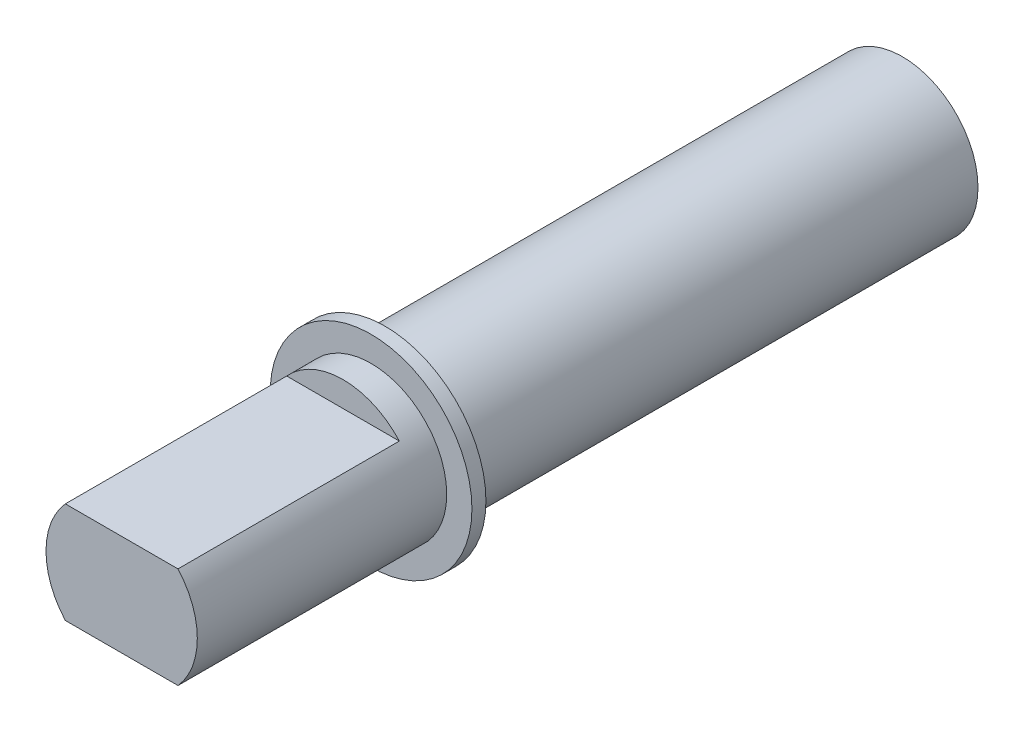
ISO-10303-21;
HEADER;
FILE_DESCRIPTION(('STEP AP214'),'2;1');
FILE_NAME('part.step','',(''),(''),'','','');
FILE_SCHEMA(('AUTOMOTIVE_DESIGN { 1 0 10303 214 1 1 1 1 }'));
ENDSEC;
DATA;
#1=APPLICATION_CONTEXT('core data for automotive mechanical design processes');
#2=APPLICATION_PROTOCOL_DEFINITION('international standard','automotive_design',2000,#1);
#3=PRODUCT_CONTEXT('',#1,'mechanical');
#4=PRODUCT('Part','Part','',(#3));
#5=PRODUCT_RELATED_PRODUCT_CATEGORY('part','',(#4));
#6=PRODUCT_DEFINITION_FORMATION('','',#4);
#7=PRODUCT_DEFINITION_CONTEXT('part definition',#1,'design');
#8=PRODUCT_DEFINITION('design','',#6,#7);
#9=PRODUCT_DEFINITION_SHAPE('','',#8);
#10=(LENGTH_UNIT() NAMED_UNIT(*) SI_UNIT(.MILLI.,.METRE.));
#11=(NAMED_UNIT(*) PLANE_ANGLE_UNIT() SI_UNIT($,.RADIAN.));
#12=(NAMED_UNIT(*) SI_UNIT($,.STERADIAN.) SOLID_ANGLE_UNIT());
#13=UNCERTAINTY_MEASURE_WITH_UNIT(LENGTH_MEASURE(1.E-05),#10,'distance_accuracy_value','');
#14=(GEOMETRIC_REPRESENTATION_CONTEXT(3) GLOBAL_UNCERTAINTY_ASSIGNED_CONTEXT((#13)) GLOBAL_UNIT_ASSIGNED_CONTEXT((#10,
#11,#12)) REPRESENTATION_CONTEXT('',''));
#15=CARTESIAN_POINT('',(0.,0.,0.));
#16=DIRECTION('',(0.,0.,1.));
#17=DIRECTION('',(1.,0.,0.));
#18=AXIS2_PLACEMENT_3D('',#15,#16,#17);
#19=CARTESIAN_POINT('',(0.,0.,10.73));
#20=DIRECTION('',(0.,0.,1.));
#21=DIRECTION('',(1.,0.,0.));
#22=AXIS2_PLACEMENT_3D('',#19,#20,#21);
#23=PLANE('',#22);
#24=CARTESIAN_POINT('',(0.,0.,10.73));
#25=DIRECTION('',(0.,0.,1.));
#26=DIRECTION('',(1.,0.,0.));
#27=AXIS2_PLACEMENT_3D('',#24,#25,#26);
#28=CIRCLE('',#27,2.7);
#29=CARTESIAN_POINT('',(-2.01,-1.80274790250884,10.73));
#30=VERTEX_POINT('',#29);
#31=CARTESIAN_POINT('',(2.01,-1.80274790250884,10.73));
#32=VERTEX_POINT('',#31);
#33=EDGE_CURVE('E50',#30,#32,#28,.T.);
#34=ORIENTED_EDGE('',*,*,#33,.T.);
#35=DIRECTION('',(-1.,0.,0.));
#36=VECTOR('',#35,1.);
#37=CARTESIAN_POINT('',(0.,-1.80274790250884,10.73));
#38=LINE('',#37,#36);
#39=EDGE_CURVE('E11',#32,#30,#38,.T.);
#40=ORIENTED_EDGE('',*,*,#39,.T.);
#41=EDGE_LOOP('',(#34,#40));
#42=FACE_BOUND('',#41,.T.);
#43=ADVANCED_FACE('F37',(#42),#23,.T.);
#44=CARTESIAN_POINT('',(0.,0.,9.23));
#45=DIRECTION('',(0.,0.,-1.));
#46=DIRECTION('',(-1.,0.,0.));
#47=AXIS2_PLACEMENT_3D('',#44,#45,#46);
#48=CYLINDRICAL_SURFACE('',#47,2.7);
#49=CARTESIAN_POINT('',(0.,0.,9.23));
#50=DIRECTION('',(0.,0.,1.));
#51=DIRECTION('',(1.,0.,0.));
#52=AXIS2_PLACEMENT_3D('',#49,#50,#51);
#53=CIRCLE('',#52,2.7);
#54=CARTESIAN_POINT('',(2.7,0.,9.23));
#55=VERTEX_POINT('',#54);
#56=EDGE_CURVE('E106',#55,#55,#53,.T.);
#57=ORIENTED_EDGE('',*,*,#56,.F.);
#58=EDGE_LOOP('',(#57));
#59=FACE_BOUND('',#58,.T.);
#60=CARTESIAN_POINT('',(0.,0.,-9.23));
#61=DIRECTION('',(0.,0.,1.));
#62=DIRECTION('',(1.,0.,0.));
#63=AXIS2_PLACEMENT_3D('',#60,#61,#62);
#64=CIRCLE('',#63,2.7);
#65=CARTESIAN_POINT('',(2.7,0.,-9.23));
#66=VERTEX_POINT('',#65);
#67=EDGE_CURVE('E110',#66,#66,#64,.T.);
#68=ORIENTED_EDGE('',*,*,#67,.T.);
#69=EDGE_LOOP('',(#68));
#70=FACE_BOUND('',#69,.T.);
#71=ADVANCED_FACE('F39',(#59,#70),#48,.T.);
#72=CARTESIAN_POINT('',(0.,0.,-9.23));
#73=DIRECTION('',(0.,0.,1.));
#74=DIRECTION('',(1.,0.,0.));
#75=AXIS2_PLACEMENT_3D('',#72,#73,#74);
#76=PLANE('',#75);
#77=ORIENTED_EDGE('',*,*,#67,.F.);
#78=EDGE_LOOP('',(#77));
#79=FACE_BOUND('',#78,.T.);
#80=ADVANCED_FACE('F140',(#79),#76,.F.);
#81=CARTESIAN_POINT('',(0.,0.,9.73));
#82=DIRECTION('',(0.,0.,-1.));
#83=DIRECTION('',(-1.,0.,0.));
#84=AXIS2_PLACEMENT_3D('',#81,#82,#83);
#85=CYLINDRICAL_SURFACE('',#84,3.6);
#86=CARTESIAN_POINT('',(0.,0.,9.73));
#87=DIRECTION('',(0.,0.,1.));
#88=DIRECTION('',(1.,0.,0.));
#89=AXIS2_PLACEMENT_3D('',#86,#87,#88);
#90=CIRCLE('',#89,3.6);
#91=CARTESIAN_POINT('',(3.6,0.,9.73));
#92=VERTEX_POINT('',#91);
#93=EDGE_CURVE('E107',#92,#92,#90,.T.);
#94=ORIENTED_EDGE('',*,*,#93,.F.);
#95=EDGE_LOOP('',(#94));
#96=FACE_BOUND('',#95,.T.);
#97=CARTESIAN_POINT('',(0.,0.,9.23));
#98=DIRECTION('',(0.,0.,1.));
#99=DIRECTION('',(1.,0.,0.));
#100=AXIS2_PLACEMENT_3D('',#97,#98,#99);
#101=CIRCLE('',#100,3.6);
#102=CARTESIAN_POINT('',(3.6,0.,9.23));
#103=VERTEX_POINT('',#102);
#104=EDGE_CURVE('E102',#103,#103,#101,.T.);
#105=ORIENTED_EDGE('',*,*,#104,.T.);
#106=EDGE_LOOP('',(#105));
#107=FACE_BOUND('',#106,.T.);
#108=ADVANCED_FACE('F145',(#96,#107),#85,.T.);
#109=CARTESIAN_POINT('',(0.,0.,9.73));
#110=DIRECTION('',(0.,0.,1.));
#111=DIRECTION('',(1.,0.,0.));
#112=AXIS2_PLACEMENT_3D('',#109,#110,#111);
#113=PLANE('',#112);
#114=CARTESIAN_POINT('',(0.,0.,9.73));
#115=DIRECTION('',(0.,0.,1.));
#116=DIRECTION('',(1.,0.,0.));
#117=AXIS2_PLACEMENT_3D('',#114,#115,#116);
#118=CIRCLE('',#117,2.7);
#119=CARTESIAN_POINT('',(2.7,0.,9.73));
#120=VERTEX_POINT('',#119);
#121=EDGE_CURVE('E103',#120,#120,#118,.T.);
#122=ORIENTED_EDGE('',*,*,#121,.F.);
#123=EDGE_LOOP('',(#122));
#124=FACE_BOUND('',#123,.T.);
#125=ORIENTED_EDGE('',*,*,#93,.T.);
#126=EDGE_LOOP('',(#125));
#127=FACE_BOUND('',#126,.T.);
#128=ADVANCED_FACE('F153',(#124,#127),#113,.T.);
#129=CARTESIAN_POINT('',(0.,0.,9.23));
#130=DIRECTION('',(0.,0.,1.));
#131=DIRECTION('',(1.,0.,0.));
#132=AXIS2_PLACEMENT_3D('',#129,#130,#131);
#133=PLANE('',#132);
#134=ORIENTED_EDGE('',*,*,#56,.T.);
#135=EDGE_LOOP('',(#134));
#136=FACE_BOUND('',#135,.T.);
#137=ORIENTED_EDGE('',*,*,#104,.F.);
#138=EDGE_LOOP('',(#137));
#139=FACE_BOUND('',#138,.T.);
#140=ADVANCED_FACE('F133',(#136,#139),#133,.F.);
#141=CARTESIAN_POINT('',(0.,0.,10.73));
#142=DIRECTION('',(0.,0.,-1.));
#143=DIRECTION('',(-1.,0.,0.));
#144=AXIS2_PLACEMENT_3D('',#141,#142,#143);
#145=CYLINDRICAL_SURFACE('',#144,2.7);
#146=ORIENTED_EDGE('',*,*,#121,.T.);
#147=EDGE_LOOP('',(#146));
#148=FACE_BOUND('',#147,.T.);
#149=CARTESIAN_POINT('',(2.01,1.80274790250884,10.73));
#150=VERTEX_POINT('',#149);
#151=CARTESIAN_POINT('',(-2.01,1.80274790250884,10.73));
#152=VERTEX_POINT('',#151);
#153=EDGE_CURVE('E96',#150,#152,#28,.T.);
#154=ORIENTED_EDGE('',*,*,#153,.F.);
#155=DIRECTION('',(0.,0.,-1.));
#156=VECTOR('',#155,1.);
#157=CARTESIAN_POINT('',(2.01,1.80274790250884,18.63));
#158=LINE('',#157,#156);
#159=CARTESIAN_POINT('',(2.01,1.80274790250884,18.63));
#160=VERTEX_POINT('',#159);
#161=EDGE_CURVE('E98',#160,#150,#158,.T.);
#162=ORIENTED_EDGE('',*,*,#161,.F.);
#163=CARTESIAN_POINT('',(0.,0.,18.63));
#164=DIRECTION('',(0.,0.,1.));
#165=DIRECTION('',(1.,0.,0.));
#166=AXIS2_PLACEMENT_3D('',#163,#164,#165);
#167=CIRCLE('',#166,2.7);
#168=CARTESIAN_POINT('',(2.01,-1.80274790250884,18.63));
#169=VERTEX_POINT('',#168);
#170=EDGE_CURVE('E82',#169,#160,#167,.T.);
#171=ORIENTED_EDGE('',*,*,#170,.F.);
#172=DIRECTION('',(0.,0.,-1.));
#173=VECTOR('',#172,1.);
#174=CARTESIAN_POINT('',(2.01,-1.80274790250884,18.63));
#175=LINE('',#174,#173);
#176=EDGE_CURVE('E79',#169,#32,#175,.T.);
#177=ORIENTED_EDGE('',*,*,#176,.T.);
#178=ORIENTED_EDGE('',*,*,#33,.F.);
#179=DIRECTION('',(0.,0.,-1.));
#180=VECTOR('',#179,1.);
#181=CARTESIAN_POINT('',(-2.01,-1.80274790250884,18.63));
#182=LINE('',#181,#180);
#183=CARTESIAN_POINT('',(-2.01,-1.80274790250884,18.63));
#184=VERTEX_POINT('',#183);
#185=EDGE_CURVE('E77',#184,#30,#182,.T.);
#186=ORIENTED_EDGE('',*,*,#185,.F.);
#187=CARTESIAN_POINT('',(-2.01,1.80274790250884,18.63));
#188=VERTEX_POINT('',#187);
#189=EDGE_CURVE('E83',#188,#184,#167,.T.);
#190=ORIENTED_EDGE('',*,*,#189,.F.);
#191=DIRECTION('',(0.,0.,-1.));
#192=VECTOR('',#191,1.);
#193=CARTESIAN_POINT('',(-2.01,1.80274790250884,18.63));
#194=LINE('',#193,#192);
#195=EDGE_CURVE('E120',#188,#152,#194,.T.);
#196=ORIENTED_EDGE('',*,*,#195,.T.);
#197=EDGE_LOOP('',(#154,#162,#171,#177,#178,#186,#190,#196));
#198=FACE_BOUND('',#197,.T.);
#199=ADVANCED_FACE('F94',(#148,#198),#145,.T.);
#200=DIRECTION('',(-1.,0.,0.));
#201=VECTOR('',#200,1.);
#202=CARTESIAN_POINT('',(0.,1.80274790250884,10.73));
#203=LINE('',#202,#201);
#204=EDGE_CURVE('E45',#150,#152,#203,.T.);
#205=ORIENTED_EDGE('',*,*,#204,.F.);
#206=ORIENTED_EDGE('',*,*,#153,.T.);
#207=EDGE_LOOP('',(#205,#206));
#208=FACE_BOUND('',#207,.T.);
#209=ADVANCED_FACE('F125',(#208),#23,.T.);
#210=CARTESIAN_POINT('',(0.,-1.80274790250884,18.63));
#211=DIRECTION('',(0.,1.,0.));
#212=DIRECTION('',(0.,0.,1.));
#213=AXIS2_PLACEMENT_3D('',#210,#211,#212);
#214=PLANE('',#213);
#215=ORIENTED_EDGE('',*,*,#39,.F.);
#216=ORIENTED_EDGE('',*,*,#176,.F.);
#217=DIRECTION('',(1.,0.,0.));
#218=VECTOR('',#217,1.);
#219=CARTESIAN_POINT('',(0.,-1.80274790250884,18.63));
#220=LINE('',#219,#218);
#221=EDGE_CURVE('E73',#184,#169,#220,.T.);
#222=ORIENTED_EDGE('',*,*,#221,.F.);
#223=ORIENTED_EDGE('',*,*,#185,.T.);
#224=EDGE_LOOP('',(#215,#216,#222,#223));
#225=FACE_BOUND('',#224,.T.);
#226=ADVANCED_FACE('F75',(#225),#214,.F.);
#227=CARTESIAN_POINT('',(0.,1.80274790250884,18.63));
#228=DIRECTION('',(0.,1.,0.));
#229=DIRECTION('',(0.,0.,1.));
#230=AXIS2_PLACEMENT_3D('',#227,#228,#229);
#231=PLANE('',#230);
#232=ORIENTED_EDGE('',*,*,#161,.T.);
#233=ORIENTED_EDGE('',*,*,#204,.T.);
#234=ORIENTED_EDGE('',*,*,#195,.F.);
#235=DIRECTION('',(1.,0.,0.));
#236=VECTOR('',#235,1.);
#237=CARTESIAN_POINT('',(0.,1.80274790250884,18.63));
#238=LINE('',#237,#236);
#239=EDGE_CURVE('E89',#188,#160,#238,.T.);
#240=ORIENTED_EDGE('',*,*,#239,.T.);
#241=EDGE_LOOP('',(#232,#233,#234,#240));
#242=FACE_BOUND('',#241,.T.);
#243=ADVANCED_FACE('F119',(#242),#231,.T.);
#244=CARTESIAN_POINT('',(0.,0.,18.63));
#245=DIRECTION('',(0.,0.,1.));
#246=DIRECTION('',(1.,0.,0.));
#247=AXIS2_PLACEMENT_3D('',#244,#245,#246);
#248=PLANE('',#247);
#249=ORIENTED_EDGE('',*,*,#189,.T.);
#250=ORIENTED_EDGE('',*,*,#221,.T.);
#251=ORIENTED_EDGE('',*,*,#170,.T.);
#252=ORIENTED_EDGE('',*,*,#239,.F.);
#253=EDGE_LOOP('',(#249,#250,#251,#252));
#254=FACE_BOUND('',#253,.T.);
#255=ADVANCED_FACE('F87',(#254),#248,.T.);
#256=CLOSED_SHELL('',(#43,#71,#80,#108,#128,#140,#199,#209,#226,#243,#255));
#257=MANIFOLD_SOLID_BREP('B2',#256);
#258=ADVANCED_BREP_SHAPE_REPRESENTATION('',(#18,#257),#14);
#259=SHAPE_DEFINITION_REPRESENTATION(#9,#258);
ENDSEC;
END-ISO-10303-21;
